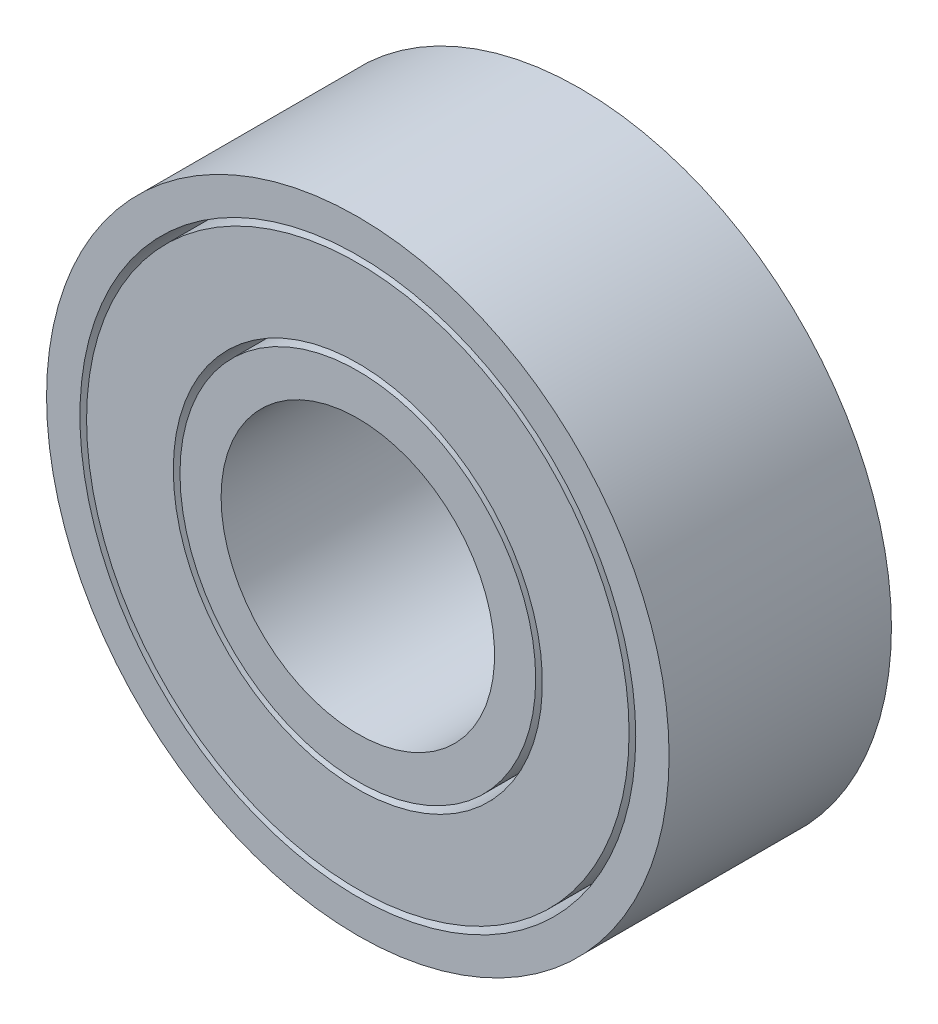
ISO-10303-21;
HEADER;
FILE_DESCRIPTION(('STEP AP214'),'2;1');
FILE_NAME('part.step','',(''),(''),'','','');
FILE_SCHEMA(('AUTOMOTIVE_DESIGN { 1 0 10303 214 1 1 1 1 }'));
ENDSEC;
DATA;
#1=APPLICATION_CONTEXT('core data for automotive mechanical design processes');
#2=APPLICATION_PROTOCOL_DEFINITION('international standard','automotive_design',2000,#1);
#3=PRODUCT_CONTEXT('',#1,'mechanical');
#4=PRODUCT('Part','Part','',(#3));
#5=PRODUCT_RELATED_PRODUCT_CATEGORY('part','',(#4));
#6=PRODUCT_DEFINITION_FORMATION('','',#4);
#7=PRODUCT_DEFINITION_CONTEXT('part definition',#1,'design');
#8=PRODUCT_DEFINITION('design','',#6,#7);
#9=PRODUCT_DEFINITION_SHAPE('','',#8);
#10=(LENGTH_UNIT() NAMED_UNIT(*) SI_UNIT(.MILLI.,.METRE.));
#11=(NAMED_UNIT(*) PLANE_ANGLE_UNIT() SI_UNIT($,.RADIAN.));
#12=(NAMED_UNIT(*) SI_UNIT($,.STERADIAN.) SOLID_ANGLE_UNIT());
#13=UNCERTAINTY_MEASURE_WITH_UNIT(LENGTH_MEASURE(1.E-05),#10,'distance_accuracy_value','');
#14=(GEOMETRIC_REPRESENTATION_CONTEXT(3) GLOBAL_UNCERTAINTY_ASSIGNED_CONTEXT((#13)) GLOBAL_UNIT_ASSIGNED_CONTEXT((#10,
#11,#12)) REPRESENTATION_CONTEXT('',''));
#15=CARTESIAN_POINT('',(0.,0.,0.));
#16=DIRECTION('',(0.,0.,1.));
#17=DIRECTION('',(1.,0.,0.));
#18=AXIS2_PLACEMENT_3D('',#15,#16,#17);
#19=CARTESIAN_POINT('',(0.,0.,10.));
#20=DIRECTION('',(0.,0.,-1.));
#21=DIRECTION('',(-1.,0.,0.));
#22=AXIS2_PLACEMENT_3D('',#19,#20,#21);
#23=CYLINDRICAL_SURFACE('',#22,8.);
#24=CARTESIAN_POINT('',(0.,0.,10.));
#25=DIRECTION('',(0.,0.,-1.));
#26=DIRECTION('',(-1.,0.,0.));
#27=AXIS2_PLACEMENT_3D('',#24,#25,#26);
#28=CIRCLE('',#27,8.);
#29=CARTESIAN_POINT('',(-8.,0.,10.));
#30=VERTEX_POINT('',#29);
#31=EDGE_CURVE('E11',#30,#30,#28,.T.);
#32=ORIENTED_EDGE('',*,*,#31,.T.);
#33=EDGE_LOOP('',(#32));
#34=FACE_BOUND('',#33,.T.);
#35=CARTESIAN_POINT('',(0.,0.,0.));
#36=DIRECTION('',(0.,0.,-1.));
#37=DIRECTION('',(-1.,0.,0.));
#38=AXIS2_PLACEMENT_3D('',#35,#36,#37);
#39=CIRCLE('',#38,8.);
#40=CARTESIAN_POINT('',(-8.,0.,0.));
#41=VERTEX_POINT('',#40);
#42=EDGE_CURVE('E51',#41,#41,#39,.T.);
#43=ORIENTED_EDGE('',*,*,#42,.F.);
#44=EDGE_LOOP('',(#43));
#45=FACE_BOUND('',#44,.T.);
#46=ADVANCED_FACE('F48',(#34,#45),#23,.T.);
#47=CARTESIAN_POINT('',(0.,0.,10.));
#48=DIRECTION('',(0.,0.,-1.));
#49=DIRECTION('',(-1.,0.,0.));
#50=AXIS2_PLACEMENT_3D('',#47,#48,#49);
#51=PLANE('',#50);
#52=CARTESIAN_POINT('',(0.,0.,10.));
#53=DIRECTION('',(0.,0.,-1.));
#54=DIRECTION('',(-1.,0.,0.));
#55=AXIS2_PLACEMENT_3D('',#52,#53,#54);
#56=CIRCLE('',#55,6.15);
#57=CARTESIAN_POINT('',(-6.15,0.,10.));
#58=VERTEX_POINT('',#57);
#59=EDGE_CURVE('E58',#58,#58,#56,.T.);
#60=ORIENTED_EDGE('',*,*,#59,.T.);
#61=EDGE_LOOP('',(#60));
#62=FACE_BOUND('',#61,.T.);
#63=ORIENTED_EDGE('',*,*,#31,.F.);
#64=EDGE_LOOP('',(#63));
#65=FACE_BOUND('',#64,.T.);
#66=ADVANCED_FACE('F66',(#62,#65),#51,.F.);
#67=CARTESIAN_POINT('',(0.,0.,0.));
#68=DIRECTION('',(0.,0.,-1.));
#69=DIRECTION('',(-1.,0.,0.));
#70=AXIS2_PLACEMENT_3D('',#67,#68,#69);
#71=PLANE('',#70);
#72=CARTESIAN_POINT('',(0.,0.,0.));
#73=DIRECTION('',(0.,0.,-1.));
#74=DIRECTION('',(-1.,0.,0.));
#75=AXIS2_PLACEMENT_3D('',#72,#73,#74);
#76=CIRCLE('',#75,6.15);
#77=CARTESIAN_POINT('',(-6.15,0.,0.));
#78=VERTEX_POINT('',#77);
#79=EDGE_CURVE('E60',#78,#78,#76,.T.);
#80=ORIENTED_EDGE('',*,*,#79,.F.);
#81=EDGE_LOOP('',(#80));
#82=FACE_BOUND('',#81,.T.);
#83=ORIENTED_EDGE('',*,*,#42,.T.);
#84=EDGE_LOOP('',(#83));
#85=FACE_BOUND('',#84,.T.);
#86=ADVANCED_FACE('F72',(#82,#85),#71,.T.);
#87=CARTESIAN_POINT('',(0.,0.,10.));
#88=DIRECTION('',(0.,0.,-1.));
#89=DIRECTION('',(-1.,0.,0.));
#90=AXIS2_PLACEMENT_3D('',#87,#88,#89);
#91=CYLINDRICAL_SURFACE('',#90,6.15);
#92=ORIENTED_EDGE('',*,*,#59,.F.);
#93=EDGE_LOOP('',(#92));
#94=FACE_BOUND('',#93,.T.);
#95=ORIENTED_EDGE('',*,*,#79,.T.);
#96=EDGE_LOOP('',(#95));
#97=FACE_BOUND('',#96,.T.);
#98=ADVANCED_FACE('F69',(#94,#97),#91,.F.);
#99=CLOSED_SHELL('',(#46,#66,#86,#98));
#100=MANIFOLD_SOLID_BREP('B2',#99);
#101=CARTESIAN_POINT('',(0.,0.,10.));
#102=DIRECTION('',(0.,0.,-1.));
#103=DIRECTION('',(-1.,0.,0.));
#104=AXIS2_PLACEMENT_3D('',#101,#102,#103);
#105=CYLINDRICAL_SURFACE('',#104,12.2);
#106=CARTESIAN_POINT('',(0.,0.,10.));
#107=DIRECTION('',(0.,0.,-1.));
#108=DIRECTION('',(-1.,0.,0.));
#109=AXIS2_PLACEMENT_3D('',#106,#107,#108);
#110=CIRCLE('',#109,12.2);
#111=CARTESIAN_POINT('',(-12.2,0.,10.));
#112=VERTEX_POINT('',#111);
#113=EDGE_CURVE('E47',#112,#112,#110,.T.);
#114=ORIENTED_EDGE('',*,*,#113,.T.);
#115=EDGE_LOOP('',(#114));
#116=FACE_BOUND('',#115,.T.);
#117=CARTESIAN_POINT('',(0.,0.,0.));
#118=DIRECTION('',(0.,0.,-1.));
#119=DIRECTION('',(-1.,0.,0.));
#120=AXIS2_PLACEMENT_3D('',#117,#118,#119);
#121=CIRCLE('',#120,12.2);
#122=CARTESIAN_POINT('',(-12.2,0.,0.));
#123=VERTEX_POINT('',#122);
#124=EDGE_CURVE('E120',#123,#123,#121,.T.);
#125=ORIENTED_EDGE('',*,*,#124,.F.);
#126=EDGE_LOOP('',(#125));
#127=FACE_BOUND('',#126,.T.);
#128=ADVANCED_FACE('F117',(#116,#127),#105,.T.);
#129=CARTESIAN_POINT('',(0.,0.,10.));
#130=DIRECTION('',(0.,0.,-1.));
#131=DIRECTION('',(-1.,0.,0.));
#132=AXIS2_PLACEMENT_3D('',#129,#130,#131);
#133=PLANE('',#132);
#134=CARTESIAN_POINT('',(0.,0.,10.));
#135=DIRECTION('',(0.,0.,-1.));
#136=DIRECTION('',(-1.,0.,0.));
#137=AXIS2_PLACEMENT_3D('',#134,#135,#136);
#138=CIRCLE('',#137,8.3);
#139=CARTESIAN_POINT('',(-8.3,0.,10.));
#140=VERTEX_POINT('',#139);
#141=EDGE_CURVE('E129',#140,#140,#138,.T.);
#142=ORIENTED_EDGE('',*,*,#141,.T.);
#143=EDGE_LOOP('',(#142));
#144=FACE_BOUND('',#143,.T.);
#145=ORIENTED_EDGE('',*,*,#113,.F.);
#146=EDGE_LOOP('',(#145));
#147=FACE_BOUND('',#146,.T.);
#148=ADVANCED_FACE('F139',(#144,#147),#133,.F.);
#149=CARTESIAN_POINT('',(0.,0.,0.));
#150=DIRECTION('',(0.,0.,-1.));
#151=DIRECTION('',(-1.,0.,0.));
#152=AXIS2_PLACEMENT_3D('',#149,#150,#151);
#153=PLANE('',#152);
#154=CARTESIAN_POINT('',(0.,0.,0.));
#155=DIRECTION('',(0.,0.,-1.));
#156=DIRECTION('',(-1.,0.,0.));
#157=AXIS2_PLACEMENT_3D('',#154,#155,#156);
#158=CIRCLE('',#157,8.3);
#159=CARTESIAN_POINT('',(-8.3,0.,0.));
#160=VERTEX_POINT('',#159);
#161=EDGE_CURVE('E131',#160,#160,#158,.T.);
#162=ORIENTED_EDGE('',*,*,#161,.F.);
#163=EDGE_LOOP('',(#162));
#164=FACE_BOUND('',#163,.T.);
#165=ORIENTED_EDGE('',*,*,#124,.T.);
#166=EDGE_LOOP('',(#165));
#167=FACE_BOUND('',#166,.T.);
#168=ADVANCED_FACE('F145',(#164,#167),#153,.T.);
#169=CARTESIAN_POINT('',(0.,0.,10.));
#170=DIRECTION('',(0.,0.,-1.));
#171=DIRECTION('',(-1.,0.,0.));
#172=AXIS2_PLACEMENT_3D('',#169,#170,#171);
#173=CYLINDRICAL_SURFACE('',#172,8.3);
#174=ORIENTED_EDGE('',*,*,#141,.F.);
#175=EDGE_LOOP('',(#174));
#176=FACE_BOUND('',#175,.T.);
#177=ORIENTED_EDGE('',*,*,#161,.T.);
#178=EDGE_LOOP('',(#177));
#179=FACE_BOUND('',#178,.T.);
#180=ADVANCED_FACE('F142',(#176,#179),#173,.F.);
#181=CLOSED_SHELL('',(#128,#148,#168,#180));
#182=MANIFOLD_SOLID_BREP('B6',#181);
#183=CARTESIAN_POINT('',(0.,0.,10.));
#184=DIRECTION('',(0.,0.,1.));
#185=DIRECTION('',(1.,0.,0.));
#186=AXIS2_PLACEMENT_3D('',#183,#184,#185);
#187=PLANE('',#186);
#188=CARTESIAN_POINT('',(0.,0.,10.));
#189=DIRECTION('',(0.,0.,1.));
#190=DIRECTION('',(1.,0.,0.));
#191=AXIS2_PLACEMENT_3D('',#188,#189,#190);
#192=CIRCLE('',#191,14.);
#193=CARTESIAN_POINT('',(14.,0.,10.));
#194=VERTEX_POINT('',#193);
#195=EDGE_CURVE('E116',#194,#194,#192,.T.);
#196=ORIENTED_EDGE('',*,*,#195,.T.);
#197=EDGE_LOOP('',(#196));
#198=FACE_BOUND('',#197,.T.);
#199=CARTESIAN_POINT('',(0.,0.,10.));
#200=DIRECTION('',(0.,0.,1.));
#201=DIRECTION('',(1.,0.,0.));
#202=AXIS2_PLACEMENT_3D('',#199,#200,#201);
#203=CIRCLE('',#202,12.5);
#204=CARTESIAN_POINT('',(12.5,0.,10.));
#205=VERTEX_POINT('',#204);
#206=EDGE_CURVE('E194',#205,#205,#203,.T.);
#207=ORIENTED_EDGE('',*,*,#206,.F.);
#208=EDGE_LOOP('',(#207));
#209=FACE_BOUND('',#208,.T.);
#210=ADVANCED_FACE('F183',(#198,#209),#187,.T.);
#211=CARTESIAN_POINT('',(0.,0.,0.));
#212=DIRECTION('',(0.,0.,1.));
#213=DIRECTION('',(1.,0.,0.));
#214=AXIS2_PLACEMENT_3D('',#211,#212,#213);
#215=PLANE('',#214);
#216=CARTESIAN_POINT('',(0.,0.,0.));
#217=DIRECTION('',(0.,0.,1.));
#218=DIRECTION('',(1.,0.,0.));
#219=AXIS2_PLACEMENT_3D('',#216,#217,#218);
#220=CIRCLE('',#219,14.);
#221=CARTESIAN_POINT('',(14.,0.,0.));
#222=VERTEX_POINT('',#221);
#223=EDGE_CURVE('E187',#222,#222,#220,.T.);
#224=ORIENTED_EDGE('',*,*,#223,.F.);
#225=EDGE_LOOP('',(#224));
#226=FACE_BOUND('',#225,.T.);
#227=CARTESIAN_POINT('',(0.,0.,0.));
#228=DIRECTION('',(0.,0.,1.));
#229=DIRECTION('',(1.,0.,0.));
#230=AXIS2_PLACEMENT_3D('',#227,#228,#229);
#231=CIRCLE('',#230,12.5);
#232=CARTESIAN_POINT('',(12.5,0.,0.));
#233=VERTEX_POINT('',#232);
#234=EDGE_CURVE('E196',#233,#233,#231,.T.);
#235=ORIENTED_EDGE('',*,*,#234,.T.);
#236=EDGE_LOOP('',(#235));
#237=FACE_BOUND('',#236,.T.);
#238=ADVANCED_FACE('F206',(#226,#237),#215,.F.);
#239=CARTESIAN_POINT('',(0.,0.,10.));
#240=DIRECTION('',(0.,0.,-1.));
#241=DIRECTION('',(-1.,0.,0.));
#242=AXIS2_PLACEMENT_3D('',#239,#240,#241);
#243=CYLINDRICAL_SURFACE('',#242,14.);
#244=ORIENTED_EDGE('',*,*,#195,.F.);
#245=EDGE_LOOP('',(#244));
#246=FACE_BOUND('',#245,.T.);
#247=ORIENTED_EDGE('',*,*,#223,.T.);
#248=EDGE_LOOP('',(#247));
#249=FACE_BOUND('',#248,.T.);
#250=ADVANCED_FACE('F185',(#246,#249),#243,.T.);
#251=CARTESIAN_POINT('',(0.,0.,10.));
#252=DIRECTION('',(0.,0.,-1.));
#253=DIRECTION('',(-1.,0.,0.));
#254=AXIS2_PLACEMENT_3D('',#251,#252,#253);
#255=CYLINDRICAL_SURFACE('',#254,12.5);
#256=ORIENTED_EDGE('',*,*,#206,.T.);
#257=EDGE_LOOP('',(#256));
#258=FACE_BOUND('',#257,.T.);
#259=ORIENTED_EDGE('',*,*,#234,.F.);
#260=EDGE_LOOP('',(#259));
#261=FACE_BOUND('',#260,.T.);
#262=ADVANCED_FACE('F202',(#258,#261),#255,.F.);
#263=CLOSED_SHELL('',(#210,#238,#250,#262));
#264=MANIFOLD_SOLID_BREP('B42',#263);
#265=ADVANCED_BREP_SHAPE_REPRESENTATION('',(#18,#100,#182,#264),#14);
#266=SHAPE_DEFINITION_REPRESENTATION(#9,#265);
ENDSEC;
END-ISO-10303-21;
